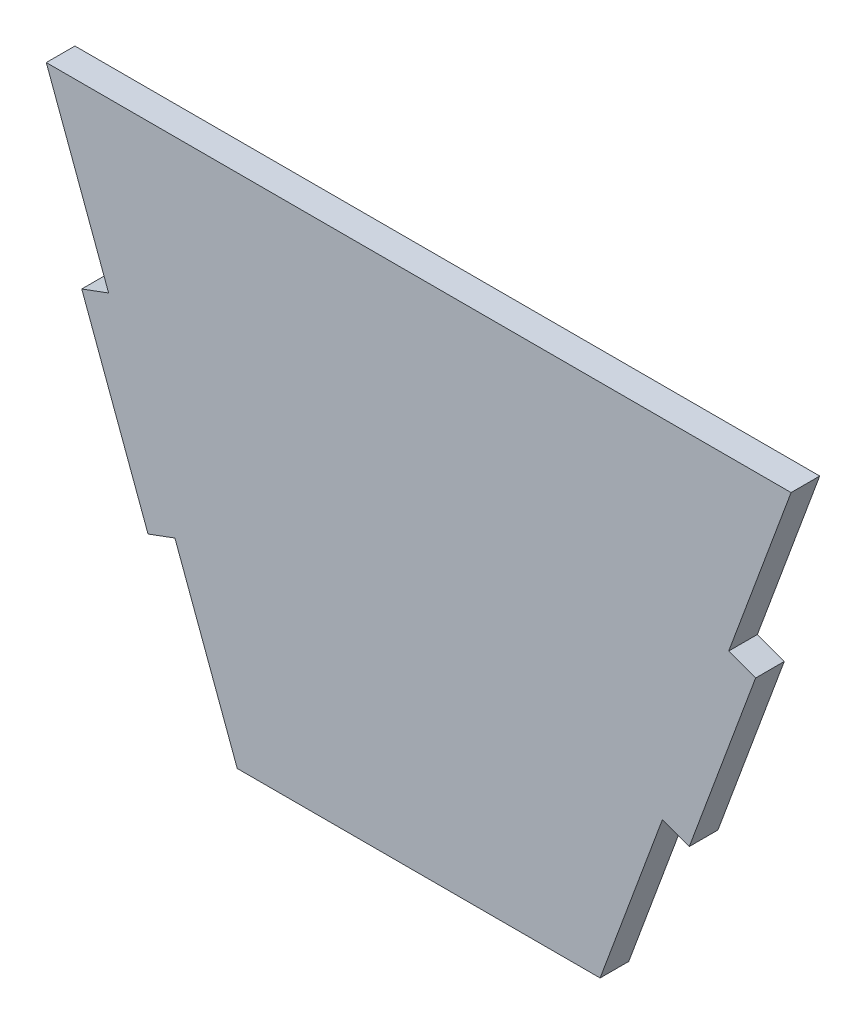
ISO-10303-21;
HEADER;
FILE_DESCRIPTION(('STEP AP214'),'2;1');
FILE_NAME('part.step','',(''),(''),'','','');
FILE_SCHEMA(('AUTOMOTIVE_DESIGN { 1 0 10303 214 1 1 1 1 }'));
ENDSEC;
DATA;
#1=APPLICATION_CONTEXT('core data for automotive mechanical design processes');
#2=APPLICATION_PROTOCOL_DEFINITION('international standard','automotive_design',2000,#1);
#3=PRODUCT_CONTEXT('',#1,'mechanical');
#4=PRODUCT('Part','Part','',(#3));
#5=PRODUCT_RELATED_PRODUCT_CATEGORY('part','',(#4));
#6=PRODUCT_DEFINITION_FORMATION('','',#4);
#7=PRODUCT_DEFINITION_CONTEXT('part definition',#1,'design');
#8=PRODUCT_DEFINITION('design','',#6,#7);
#9=PRODUCT_DEFINITION_SHAPE('','',#8);
#10=(LENGTH_UNIT() NAMED_UNIT(*) SI_UNIT(.MILLI.,.METRE.));
#11=(NAMED_UNIT(*) PLANE_ANGLE_UNIT() SI_UNIT($,.RADIAN.));
#12=(NAMED_UNIT(*) SI_UNIT($,.STERADIAN.) SOLID_ANGLE_UNIT());
#13=UNCERTAINTY_MEASURE_WITH_UNIT(LENGTH_MEASURE(1.E-05),#10,'distance_accuracy_value','');
#14=(GEOMETRIC_REPRESENTATION_CONTEXT(3) GLOBAL_UNCERTAINTY_ASSIGNED_CONTEXT((#13)) GLOBAL_UNIT_ASSIGNED_CONTEXT((#10,
#11,#12)) REPRESENTATION_CONTEXT('',''));
#15=CARTESIAN_POINT('',(0.,0.,0.));
#16=DIRECTION('',(0.,0.,1.));
#17=DIRECTION('',(1.,0.,0.));
#18=AXIS2_PLACEMENT_3D('',#15,#16,#17);
#19=CARTESIAN_POINT('',(6.52838048949832,-17.6354266516106,3.));
#20=DIRECTION('',(0.937805192853529,0.347161951050163,0.));
#21=DIRECTION('',(-0.347161951050163,0.937805192853529,0.));
#22=AXIS2_PLACEMENT_3D('',#19,#20,#21);
#23=PLANE('',#22);
#24=DIRECTION('',(0.347161951050163,-0.937805192853529,0.));
#25=VECTOR('',#24,1.);
#26=CARTESIAN_POINT('',(6.52838048949832,-17.6354266516106,0.));
#27=LINE('',#26,#25);
#28=CARTESIAN_POINT('',(0.,0.,0.));
#29=VERTEX_POINT('',#28);
#30=CARTESIAN_POINT('',(6.52838048949832,-17.6354266516106,0.));
#31=VERTEX_POINT('',#30);
#32=EDGE_CURVE('E153',#29,#31,#27,.T.);
#33=ORIENTED_EDGE('',*,*,#32,.T.);
#34=DIRECTION('',(0.,0.,-1.));
#35=VECTOR('',#34,1.);
#36=CARTESIAN_POINT('',(6.52838048949832,-17.6354266516106,3.));
#37=LINE('',#36,#35);
#38=CARTESIAN_POINT('',(6.52838048949832,-17.6354266516106,3.));
#39=VERTEX_POINT('',#38);
#40=EDGE_CURVE('E11',#39,#31,#37,.T.);
#41=ORIENTED_EDGE('',*,*,#40,.F.);
#42=DIRECTION('',(0.347161951050163,-0.937805192853529,0.));
#43=VECTOR('',#42,1.);
#44=CARTESIAN_POINT('',(6.52838048949832,-17.6354266516106,3.));
#45=LINE('',#44,#43);
#46=CARTESIAN_POINT('',(0.,0.,3.));
#47=VERTEX_POINT('',#46);
#48=EDGE_CURVE('E175',#47,#39,#45,.T.);
#49=ORIENTED_EDGE('',*,*,#48,.F.);
#50=DIRECTION('',(0.,0.,-1.));
#51=VECTOR('',#50,1.);
#52=CARTESIAN_POINT('',(0.,0.,3.));
#53=LINE('',#52,#51);
#54=EDGE_CURVE('E149',#47,#29,#53,.T.);
#55=ORIENTED_EDGE('',*,*,#54,.T.);
#56=EDGE_LOOP('',(#33,#41,#49,#55));
#57=FACE_BOUND('',#56,.T.);
#58=ADVANCED_FACE('F33',(#57),#23,.F.);
#59=CARTESIAN_POINT('',(6.52838048949832,-17.6354266516106,3.));
#60=DIRECTION('',(0.347161951050164,-0.937805192853528,0.));
#61=DIRECTION('',(0.937805192853528,0.347161951050164,0.));
#62=AXIS2_PLACEMENT_3D('',#59,#60,#61);
#63=PLANE('',#62);
#64=DIRECTION('',(-0.937805192853528,-0.347161951050164,0.));
#65=VECTOR('',#64,1.);
#66=CARTESIAN_POINT('',(6.52838048949832,-17.6354266516106,0.));
#67=LINE('',#66,#65);
#68=CARTESIAN_POINT('',(3.71496491093774,-18.6769125047611,0.));
#69=VERTEX_POINT('',#68);
#70=EDGE_CURVE('E156',#31,#69,#67,.T.);
#71=ORIENTED_EDGE('',*,*,#70,.T.);
#72=DIRECTION('',(0.,0.,-1.));
#73=VECTOR('',#72,1.);
#74=CARTESIAN_POINT('',(3.71496491093774,-18.6769125047611,3.));
#75=LINE('',#74,#73);
#76=CARTESIAN_POINT('',(3.71496491093774,-18.6769125047611,3.));
#77=VERTEX_POINT('',#76);
#78=EDGE_CURVE('E41',#77,#69,#75,.T.);
#79=ORIENTED_EDGE('',*,*,#78,.F.);
#80=DIRECTION('',(-0.937805192853528,-0.347161951050164,0.));
#81=VECTOR('',#80,1.);
#82=CARTESIAN_POINT('',(6.52838048949832,-17.6354266516106,3.));
#83=LINE('',#82,#81);
#84=EDGE_CURVE('E104',#39,#77,#83,.T.);
#85=ORIENTED_EDGE('',*,*,#84,.F.);
#86=ORIENTED_EDGE('',*,*,#40,.T.);
#87=EDGE_LOOP('',(#71,#79,#85,#86));
#88=FACE_BOUND('',#87,.T.);
#89=ADVANCED_FACE('F253',(#88),#63,.F.);
#90=CARTESIAN_POINT('',(10.6582039319411,-37.4330163618316,3.));
#91=DIRECTION('',(0.937805192853528,0.347161951050166,0.));
#92=DIRECTION('',(-0.347161951050166,0.937805192853528,0.));
#93=AXIS2_PLACEMENT_3D('',#90,#91,#92);
#94=PLANE('',#93);
#95=DIRECTION('',(0.347161951050166,-0.937805192853528,0.));
#96=VECTOR('',#95,1.);
#97=CARTESIAN_POINT('',(10.6582039319411,-37.4330163618316,0.));
#98=LINE('',#97,#96);
#99=CARTESIAN_POINT('',(10.6582039319411,-37.4330163618316,0.));
#100=VERTEX_POINT('',#99);
#101=EDGE_CURVE('E158',#69,#100,#98,.T.);
#102=ORIENTED_EDGE('',*,*,#101,.T.);
#103=DIRECTION('',(0.,0.,-1.));
#104=VECTOR('',#103,1.);
#105=CARTESIAN_POINT('',(10.6582039319411,-37.4330163618316,3.));
#106=LINE('',#105,#104);
#107=CARTESIAN_POINT('',(10.6582039319411,-37.4330163618316,3.));
#108=VERTEX_POINT('',#107);
#109=EDGE_CURVE('E194',#108,#100,#106,.T.);
#110=ORIENTED_EDGE('',*,*,#109,.F.);
#111=DIRECTION('',(0.347161951050166,-0.937805192853528,0.));
#112=VECTOR('',#111,1.);
#113=CARTESIAN_POINT('',(10.6582039319411,-37.4330163618316,3.));
#114=LINE('',#113,#112);
#115=EDGE_CURVE('E202',#77,#108,#114,.T.);
#116=ORIENTED_EDGE('',*,*,#115,.F.);
#117=ORIENTED_EDGE('',*,*,#78,.T.);
#118=EDGE_LOOP('',(#102,#110,#116,#117));
#119=FACE_BOUND('',#118,.T.);
#120=ADVANCED_FACE('F200',(#119),#94,.F.);
#121=CARTESIAN_POINT('',(13.4716195105016,-36.3915305086812,3.));
#122=DIRECTION('',(-0.347161951050161,0.93780519285353,0.));
#123=DIRECTION('',(-0.93780519285353,-0.347161951050161,0.));
#124=AXIS2_PLACEMENT_3D('',#121,#122,#123);
#125=PLANE('',#124);
#126=DIRECTION('',(0.93780519285353,0.347161951050161,0.));
#127=VECTOR('',#126,1.);
#128=CARTESIAN_POINT('',(13.4716195105016,-36.3915305086812,0.));
#129=LINE('',#128,#127);
#130=CARTESIAN_POINT('',(13.4716195105016,-36.3915305086812,0.));
#131=VERTEX_POINT('',#130);
#132=EDGE_CURVE('E160',#100,#131,#129,.T.);
#133=ORIENTED_EDGE('',*,*,#132,.T.);
#134=DIRECTION('',(0.,0.,-1.));
#135=VECTOR('',#134,1.);
#136=CARTESIAN_POINT('',(13.4716195105016,-36.3915305086812,3.));
#137=LINE('',#136,#135);
#138=CARTESIAN_POINT('',(13.4716195105016,-36.3915305086812,3.));
#139=VERTEX_POINT('',#138);
#140=EDGE_CURVE('E191',#139,#131,#137,.T.);
#141=ORIENTED_EDGE('',*,*,#140,.F.);
#142=DIRECTION('',(0.93780519285353,0.347161951050161,0.));
#143=VECTOR('',#142,1.);
#144=CARTESIAN_POINT('',(13.4716195105016,-36.3915305086812,3.));
#145=LINE('',#144,#143);
#146=EDGE_CURVE('E220',#108,#139,#145,.T.);
#147=ORIENTED_EDGE('',*,*,#146,.F.);
#148=ORIENTED_EDGE('',*,*,#109,.T.);
#149=EDGE_LOOP('',(#133,#141,#147,#148));
#150=FACE_BOUND('',#149,.T.);
#151=ADVANCED_FACE('F211',(#150),#125,.F.);
#152=CARTESIAN_POINT('',(13.4716195105016,-36.3915305086812,3.));
#153=DIRECTION('',(0.937805192853528,0.347161951050165,0.));
#154=DIRECTION('',(-0.347161951050165,0.937805192853528,0.));
#155=AXIS2_PLACEMENT_3D('',#152,#153,#154);
#156=PLANE('',#155);
#157=DIRECTION('',(0.347161951050165,-0.937805192853528,0.));
#158=VECTOR('',#157,1.);
#159=CARTESIAN_POINT('',(13.4716195105016,-36.3915305086812,0.));
#160=LINE('',#159,#158);
#161=CARTESIAN_POINT('',(20.,-54.0269571602918,0.));
#162=VERTEX_POINT('',#161);
#163=EDGE_CURVE('E162',#131,#162,#160,.T.);
#164=ORIENTED_EDGE('',*,*,#163,.T.);
#165=DIRECTION('',(0.,0.,-1.));
#166=VECTOR('',#165,1.);
#167=CARTESIAN_POINT('',(20.,-54.0269571602918,3.));
#168=LINE('',#167,#166);
#169=CARTESIAN_POINT('',(20.,-54.0269571602918,3.));
#170=VERTEX_POINT('',#169);
#171=EDGE_CURVE('E188',#170,#162,#168,.T.);
#172=ORIENTED_EDGE('',*,*,#171,.F.);
#173=DIRECTION('',(0.347161951050165,-0.937805192853528,0.));
#174=VECTOR('',#173,1.);
#175=CARTESIAN_POINT('',(13.4716195105016,-36.3915305086812,3.));
#176=LINE('',#175,#174);
#177=EDGE_CURVE('E217',#139,#170,#176,.T.);
#178=ORIENTED_EDGE('',*,*,#177,.F.);
#179=ORIENTED_EDGE('',*,*,#140,.T.);
#180=EDGE_LOOP('',(#164,#172,#178,#179));
#181=FACE_BOUND('',#180,.T.);
#182=ADVANCED_FACE('F215',(#181),#156,.F.);
#183=CARTESIAN_POINT('',(20.,-54.0269571602918,3.));
#184=DIRECTION('',(0.,1.,0.));
#185=DIRECTION('',(0.,0.,1.));
#186=AXIS2_PLACEMENT_3D('',#183,#184,#185);
#187=PLANE('',#186);
#188=DIRECTION('',(1.,0.,0.));
#189=VECTOR('',#188,1.);
#190=CARTESIAN_POINT('',(20.,-54.0269571602918,0.));
#191=LINE('',#190,#189);
#192=CARTESIAN_POINT('',(58.,-54.0269571602918,0.));
#193=VERTEX_POINT('',#192);
#194=EDGE_CURVE('E164',#162,#193,#191,.T.);
#195=ORIENTED_EDGE('',*,*,#194,.T.);
#196=DIRECTION('',(0.,0.,-1.));
#197=VECTOR('',#196,1.);
#198=CARTESIAN_POINT('',(58.,-54.0269571602918,3.));
#199=LINE('',#198,#197);
#200=CARTESIAN_POINT('',(58.,-54.0269571602918,3.));
#201=VERTEX_POINT('',#200);
#202=EDGE_CURVE('E185',#201,#193,#199,.T.);
#203=ORIENTED_EDGE('',*,*,#202,.F.);
#204=DIRECTION('',(1.,0.,0.));
#205=VECTOR('',#204,1.);
#206=CARTESIAN_POINT('',(20.,-54.0269571602918,3.));
#207=LINE('',#206,#205);
#208=EDGE_CURVE('E219',#170,#201,#207,.T.);
#209=ORIENTED_EDGE('',*,*,#208,.F.);
#210=ORIENTED_EDGE('',*,*,#171,.T.);
#211=EDGE_LOOP('',(#195,#203,#209,#210));
#212=FACE_BOUND('',#211,.T.);
#213=ADVANCED_FACE('F266',(#212),#187,.F.);
#214=CARTESIAN_POINT('',(64.5283804894983,-36.3915305086812,3.));
#215=DIRECTION('',(-0.937805192853528,0.347161951050164,0.));
#216=DIRECTION('',(-0.347161951050164,-0.937805192853528,0.));
#217=AXIS2_PLACEMENT_3D('',#214,#215,#216);
#218=PLANE('',#217);
#219=DIRECTION('',(0.347161951050164,0.937805192853528,0.));
#220=VECTOR('',#219,1.);
#221=CARTESIAN_POINT('',(64.5283804894983,-36.3915305086812,0.));
#222=LINE('',#221,#220);
#223=CARTESIAN_POINT('',(64.5283804894983,-36.3915305086812,0.));
#224=VERTEX_POINT('',#223);
#225=EDGE_CURVE('E166',#193,#224,#222,.T.);
#226=ORIENTED_EDGE('',*,*,#225,.T.);
#227=DIRECTION('',(0.,0.,-1.));
#228=VECTOR('',#227,1.);
#229=CARTESIAN_POINT('',(64.5283804894983,-36.3915305086812,3.));
#230=LINE('',#229,#228);
#231=CARTESIAN_POINT('',(64.5283804894983,-36.3915305086812,3.));
#232=VERTEX_POINT('',#231);
#233=EDGE_CURVE('E182',#232,#224,#230,.T.);
#234=ORIENTED_EDGE('',*,*,#233,.F.);
#235=DIRECTION('',(0.347161951050164,0.937805192853528,0.));
#236=VECTOR('',#235,1.);
#237=CARTESIAN_POINT('',(64.5283804894983,-36.3915305086812,3.));
#238=LINE('',#237,#236);
#239=EDGE_CURVE('E222',#201,#232,#238,.T.);
#240=ORIENTED_EDGE('',*,*,#239,.F.);
#241=ORIENTED_EDGE('',*,*,#202,.T.);
#242=EDGE_LOOP('',(#226,#234,#240,#241));
#243=FACE_BOUND('',#242,.T.);
#244=ADVANCED_FACE('F269',(#243),#218,.F.);
#245=CARTESIAN_POINT('',(64.5283804894983,-36.3915305086812,3.));
#246=DIRECTION('',(0.347161951050165,0.937805192853528,0.));
#247=DIRECTION('',(-0.937805192853528,0.347161951050165,0.));
#248=AXIS2_PLACEMENT_3D('',#245,#246,#247);
#249=PLANE('',#248);
#250=DIRECTION('',(0.937805192853528,-0.347161951050165,0.));
#251=VECTOR('',#250,1.);
#252=CARTESIAN_POINT('',(64.5283804894983,-36.3915305086812,0.));
#253=LINE('',#252,#251);
#254=CARTESIAN_POINT('',(67.341796068059,-37.4330163618317,0.));
#255=VERTEX_POINT('',#254);
#256=EDGE_CURVE('E168',#224,#255,#253,.T.);
#257=ORIENTED_EDGE('',*,*,#256,.T.);
#258=DIRECTION('',(0.,0.,-1.));
#259=VECTOR('',#258,1.);
#260=CARTESIAN_POINT('',(67.341796068059,-37.4330163618317,3.));
#261=LINE('',#260,#259);
#262=CARTESIAN_POINT('',(67.341796068059,-37.4330163618317,3.));
#263=VERTEX_POINT('',#262);
#264=EDGE_CURVE('E179',#263,#255,#261,.T.);
#265=ORIENTED_EDGE('',*,*,#264,.F.);
#266=DIRECTION('',(0.937805192853528,-0.347161951050165,0.));
#267=VECTOR('',#266,1.);
#268=CARTESIAN_POINT('',(64.5283804894983,-36.3915305086812,3.));
#269=LINE('',#268,#267);
#270=EDGE_CURVE('E228',#232,#263,#269,.T.);
#271=ORIENTED_EDGE('',*,*,#270,.F.);
#272=ORIENTED_EDGE('',*,*,#233,.T.);
#273=EDGE_LOOP('',(#257,#265,#271,#272));
#274=FACE_BOUND('',#273,.T.);
#275=ADVANCED_FACE('F234',(#274),#249,.F.);
#276=CARTESIAN_POINT('',(67.341796068059,-37.4330163618317,3.));
#277=DIRECTION('',(-0.937805192853529,0.347161951050163,0.));
#278=DIRECTION('',(-0.347161951050163,-0.937805192853529,0.));
#279=AXIS2_PLACEMENT_3D('',#276,#277,#278);
#280=PLANE('',#279);
#281=DIRECTION('',(0.347161951050163,0.937805192853529,0.));
#282=VECTOR('',#281,1.);
#283=CARTESIAN_POINT('',(67.341796068059,-37.4330163618317,0.));
#284=LINE('',#283,#282);
#285=CARTESIAN_POINT('',(74.2850350890622,-18.6769125047611,0.));
#286=VERTEX_POINT('',#285);
#287=EDGE_CURVE('E170',#255,#286,#284,.T.);
#288=ORIENTED_EDGE('',*,*,#287,.T.);
#289=DIRECTION('',(0.,0.,-1.));
#290=VECTOR('',#289,1.);
#291=CARTESIAN_POINT('',(74.2850350890622,-18.6769125047611,3.));
#292=LINE('',#291,#290);
#293=CARTESIAN_POINT('',(74.2850350890622,-18.6769125047611,3.));
#294=VERTEX_POINT('',#293);
#295=EDGE_CURVE('E144',#294,#286,#292,.T.);
#296=ORIENTED_EDGE('',*,*,#295,.F.);
#297=DIRECTION('',(0.347161951050163,0.937805192853529,0.));
#298=VECTOR('',#297,1.);
#299=CARTESIAN_POINT('',(67.341796068059,-37.4330163618317,3.));
#300=LINE('',#299,#298);
#301=EDGE_CURVE('E135',#263,#294,#300,.T.);
#302=ORIENTED_EDGE('',*,*,#301,.F.);
#303=ORIENTED_EDGE('',*,*,#264,.T.);
#304=EDGE_LOOP('',(#288,#296,#302,#303));
#305=FACE_BOUND('',#304,.T.);
#306=ADVANCED_FACE('F238',(#305),#280,.F.);
#307=CARTESIAN_POINT('',(74.2850350890622,-18.6769125047611,3.));
#308=DIRECTION('',(-0.34716195105016,-0.93780519285353,0.));
#309=DIRECTION('',(0.93780519285353,-0.34716195105016,0.));
#310=AXIS2_PLACEMENT_3D('',#307,#308,#309);
#311=PLANE('',#310);
#312=DIRECTION('',(-0.93780519285353,0.34716195105016,0.));
#313=VECTOR('',#312,1.);
#314=CARTESIAN_POINT('',(74.2850350890622,-18.6769125047611,0.));
#315=LINE('',#314,#313);
#316=CARTESIAN_POINT('',(71.4716195105017,-17.6354266516106,0.));
#317=VERTEX_POINT('',#316);
#318=EDGE_CURVE('E143',#286,#317,#315,.T.);
#319=ORIENTED_EDGE('',*,*,#318,.T.);
#320=DIRECTION('',(0.,0.,-1.));
#321=VECTOR('',#320,1.);
#322=CARTESIAN_POINT('',(71.4716195105017,-17.6354266516106,3.));
#323=LINE('',#322,#321);
#324=CARTESIAN_POINT('',(71.4716195105017,-17.6354266516106,3.));
#325=VERTEX_POINT('',#324);
#326=EDGE_CURVE('E140',#325,#317,#323,.T.);
#327=ORIENTED_EDGE('',*,*,#326,.F.);
#328=DIRECTION('',(-0.93780519285353,0.34716195105016,0.));
#329=VECTOR('',#328,1.);
#330=CARTESIAN_POINT('',(74.2850350890622,-18.6769125047611,3.));
#331=LINE('',#330,#329);
#332=EDGE_CURVE('E129',#294,#325,#331,.T.);
#333=ORIENTED_EDGE('',*,*,#332,.F.);
#334=ORIENTED_EDGE('',*,*,#295,.T.);
#335=EDGE_LOOP('',(#319,#327,#333,#334));
#336=FACE_BOUND('',#335,.T.);
#337=ADVANCED_FACE('F141',(#336),#311,.F.);
#338=CARTESIAN_POINT('',(71.4716195105017,-17.6354266516106,3.));
#339=DIRECTION('',(-0.937805192853528,0.347161951050165,0.));
#340=DIRECTION('',(-0.347161951050165,-0.937805192853528,0.));
#341=AXIS2_PLACEMENT_3D('',#338,#339,#340);
#342=PLANE('',#341);
#343=DIRECTION('',(0.347161951050165,0.937805192853528,0.));
#344=VECTOR('',#343,1.);
#345=CARTESIAN_POINT('',(71.4716195105017,-17.6354266516106,0.));
#346=LINE('',#345,#344);
#347=CARTESIAN_POINT('',(78.,0.,0.));
#348=VERTEX_POINT('',#347);
#349=EDGE_CURVE('E90',#317,#348,#346,.T.);
#350=ORIENTED_EDGE('',*,*,#349,.T.);
#351=DIRECTION('',(0.,0.,-1.));
#352=VECTOR('',#351,1.);
#353=CARTESIAN_POINT('',(78.,0.,3.));
#354=LINE('',#353,#352);
#355=CARTESIAN_POINT('',(78.,0.,3.));
#356=VERTEX_POINT('',#355);
#357=EDGE_CURVE('E145',#356,#348,#354,.T.);
#358=ORIENTED_EDGE('',*,*,#357,.F.);
#359=DIRECTION('',(0.347161951050165,0.937805192853528,0.));
#360=VECTOR('',#359,1.);
#361=CARTESIAN_POINT('',(71.4716195105017,-17.6354266516106,3.));
#362=LINE('',#361,#360);
#363=EDGE_CURVE('E133',#325,#356,#362,.T.);
#364=ORIENTED_EDGE('',*,*,#363,.F.);
#365=ORIENTED_EDGE('',*,*,#326,.T.);
#366=EDGE_LOOP('',(#350,#358,#364,#365));
#367=FACE_BOUND('',#366,.T.);
#368=ADVANCED_FACE('F147',(#367),#342,.F.);
#369=CARTESIAN_POINT('',(0.,0.,3.));
#370=DIRECTION('',(0.,-1.,0.));
#371=DIRECTION('',(0.,0.,-1.));
#372=AXIS2_PLACEMENT_3D('',#369,#370,#371);
#373=PLANE('',#372);
#374=DIRECTION('',(-1.,0.,0.));
#375=VECTOR('',#374,1.);
#376=CARTESIAN_POINT('',(0.,0.,0.));
#377=LINE('',#376,#375);
#378=EDGE_CURVE('E96',#348,#29,#377,.T.);
#379=ORIENTED_EDGE('',*,*,#378,.T.);
#380=ORIENTED_EDGE('',*,*,#54,.F.);
#381=DIRECTION('',(-1.,0.,0.));
#382=VECTOR('',#381,1.);
#383=CARTESIAN_POINT('',(0.,0.,3.));
#384=LINE('',#383,#382);
#385=EDGE_CURVE('E49',#356,#47,#384,.T.);
#386=ORIENTED_EDGE('',*,*,#385,.F.);
#387=ORIENTED_EDGE('',*,*,#357,.T.);
#388=EDGE_LOOP('',(#379,#380,#386,#387));
#389=FACE_BOUND('',#388,.T.);
#390=ADVANCED_FACE('F242',(#389),#373,.F.);
#391=CARTESIAN_POINT('',(0.,0.,3.));
#392=DIRECTION('',(0.,0.,1.));
#393=DIRECTION('',(1.,0.,0.));
#394=AXIS2_PLACEMENT_3D('',#391,#392,#393);
#395=PLANE('',#394);
#396=ORIENTED_EDGE('',*,*,#48,.T.);
#397=ORIENTED_EDGE('',*,*,#84,.T.);
#398=ORIENTED_EDGE('',*,*,#115,.T.);
#399=ORIENTED_EDGE('',*,*,#146,.T.);
#400=ORIENTED_EDGE('',*,*,#177,.T.);
#401=ORIENTED_EDGE('',*,*,#208,.T.);
#402=ORIENTED_EDGE('',*,*,#239,.T.);
#403=ORIENTED_EDGE('',*,*,#270,.T.);
#404=ORIENTED_EDGE('',*,*,#301,.T.);
#405=ORIENTED_EDGE('',*,*,#332,.T.);
#406=ORIENTED_EDGE('',*,*,#363,.T.);
#407=ORIENTED_EDGE('',*,*,#385,.T.);
#408=EDGE_LOOP('',(#396,#397,#398,#399,#400,#401,#402,#403,#404,#405,#406,#407));
#409=FACE_BOUND('',#408,.T.);
#410=ADVANCED_FACE('F131',(#409),#395,.T.);
#411=CARTESIAN_POINT('',(0.,0.,0.));
#412=DIRECTION('',(0.,0.,1.));
#413=DIRECTION('',(1.,0.,0.));
#414=AXIS2_PLACEMENT_3D('',#411,#412,#413);
#415=PLANE('',#414);
#416=ORIENTED_EDGE('',*,*,#32,.F.);
#417=ORIENTED_EDGE('',*,*,#378,.F.);
#418=ORIENTED_EDGE('',*,*,#349,.F.);
#419=ORIENTED_EDGE('',*,*,#318,.F.);
#420=ORIENTED_EDGE('',*,*,#287,.F.);
#421=ORIENTED_EDGE('',*,*,#256,.F.);
#422=ORIENTED_EDGE('',*,*,#225,.F.);
#423=ORIENTED_EDGE('',*,*,#194,.F.);
#424=ORIENTED_EDGE('',*,*,#163,.F.);
#425=ORIENTED_EDGE('',*,*,#132,.F.);
#426=ORIENTED_EDGE('',*,*,#101,.F.);
#427=ORIENTED_EDGE('',*,*,#70,.F.);
#428=EDGE_LOOP('',(#416,#417,#418,#419,#420,#421,#422,#423,#424,#425,#426,#427));
#429=FACE_BOUND('',#428,.T.);
#430=ADVANCED_FACE('F206',(#429),#415,.F.);
#431=CLOSED_SHELL('',(#58,#89,#120,#151,#182,#213,#244,#275,#306,#337,#368,#390,#410,#430));
#432=MANIFOLD_SOLID_BREP('B2',#431);
#433=ADVANCED_BREP_SHAPE_REPRESENTATION('',(#18,#432),#14);
#434=SHAPE_DEFINITION_REPRESENTATION(#9,#433);
ENDSEC;
END-ISO-10303-21;
